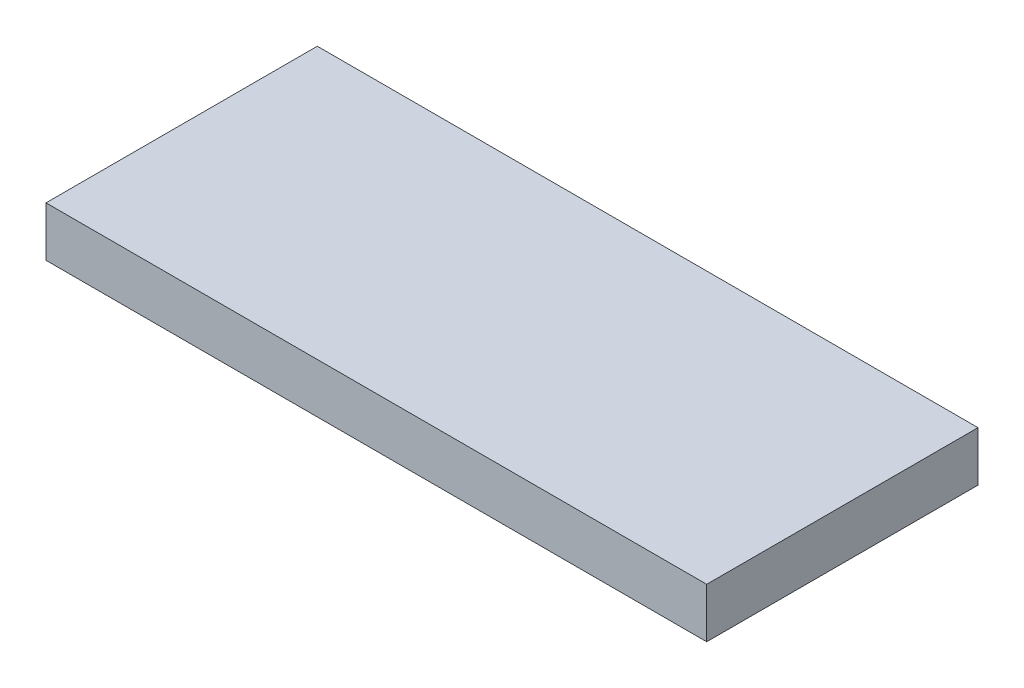
ISO-10303-21;
HEADER;
FILE_DESCRIPTION(('STEP AP214'),'2;1');
FILE_NAME('part.step','',(''),(''),'','','');
FILE_SCHEMA(('AUTOMOTIVE_DESIGN { 1 0 10303 214 1 1 1 1 }'));
ENDSEC;
DATA;
#1=APPLICATION_CONTEXT('core data for automotive mechanical design processes');
#2=APPLICATION_PROTOCOL_DEFINITION('international standard','automotive_design',2000,#1);
#3=PRODUCT_CONTEXT('',#1,'mechanical');
#4=PRODUCT('Part','Part','',(#3));
#5=PRODUCT_RELATED_PRODUCT_CATEGORY('part','',(#4));
#6=PRODUCT_DEFINITION_FORMATION('','',#4);
#7=PRODUCT_DEFINITION_CONTEXT('part definition',#1,'design');
#8=PRODUCT_DEFINITION('design','',#6,#7);
#9=PRODUCT_DEFINITION_SHAPE('','',#8);
#10=(LENGTH_UNIT() NAMED_UNIT(*) SI_UNIT(.MILLI.,.METRE.));
#11=(NAMED_UNIT(*) PLANE_ANGLE_UNIT() SI_UNIT($,.RADIAN.));
#12=(NAMED_UNIT(*) SI_UNIT($,.STERADIAN.) SOLID_ANGLE_UNIT());
#13=UNCERTAINTY_MEASURE_WITH_UNIT(LENGTH_MEASURE(1.E-05),#10,'distance_accuracy_value','');
#14=(GEOMETRIC_REPRESENTATION_CONTEXT(3) GLOBAL_UNCERTAINTY_ASSIGNED_CONTEXT((#13)) GLOBAL_UNIT_ASSIGNED_CONTEXT((#10,
#11,#12)) REPRESENTATION_CONTEXT('',''));
#15=CARTESIAN_POINT('',(0.,0.,0.));
#16=DIRECTION('',(0.,0.,1.));
#17=DIRECTION('',(1.,0.,0.));
#18=AXIS2_PLACEMENT_3D('',#15,#16,#17);
#19=CARTESIAN_POINT('',(-34.1999999999999,1.15622179664975,20.));
#20=DIRECTION('',(1.,0.,0.));
#21=DIRECTION('',(0.,0.,-1.));
#22=AXIS2_PLACEMENT_3D('',#19,#20,#21);
#23=PLANE('',#22);
#24=DIRECTION('',(0.,-1.,0.));
#25=VECTOR('',#24,1.);
#26=CARTESIAN_POINT('',(-34.1999999999999,-1.84377820335027,1.49999999999993));
#27=LINE('',#26,#25);
#28=CARTESIAN_POINT('',(-34.1999999999999,-0.283778203350142,1.49999999999992));
#29=VERTEX_POINT('',#28);
#30=CARTESIAN_POINT('',(-34.1999999999999,-3.40377820335037,1.49999999999995));
#31=VERTEX_POINT('',#30);
#32=EDGE_CURVE('E13',#29,#31,#27,.T.);
#33=ORIENTED_EDGE('',*,*,#32,.T.);
#34=DIRECTION('',(2.44902137784949E-13,0.,-1.));
#35=VECTOR('',#34,1.);
#36=CARTESIAN_POINT('',(-34.1999999999994,-3.40377820335034,10.0000000000005));
#37=LINE('',#36,#35);
#38=CARTESIAN_POINT('',(-34.1999999999999,-3.40377820335037,18.5000000000001));
#39=VERTEX_POINT('',#38);
#40=EDGE_CURVE('E217',#39,#31,#37,.T.);
#41=ORIENTED_EDGE('',*,*,#40,.F.);
#42=DIRECTION('',(0.,-1.,-2.13504427812522E-13));
#43=VECTOR('',#42,1.);
#44=CARTESIAN_POINT('',(-34.1999999999999,-1.8437782033503,18.4999999999999));
#45=LINE('',#44,#43);
#46=CARTESIAN_POINT('',(-34.2,-0.28377820335024,18.5));
#47=VERTEX_POINT('',#46);
#48=EDGE_CURVE('E205',#47,#39,#45,.T.);
#49=ORIENTED_EDGE('',*,*,#48,.F.);
#50=DIRECTION('',(2.71841372941265E-13,0.,-1.));
#51=VECTOR('',#50,1.);
#52=CARTESIAN_POINT('',(-34.1999999999994,-0.283778203350362,10.0000000000002));
#53=LINE('',#52,#51);
#54=EDGE_CURVE('E156',#47,#29,#53,.T.);
#55=ORIENTED_EDGE('',*,*,#54,.T.);
#56=EDGE_LOOP('',(#33,#41,#49,#55));
#57=FACE_BOUND('',#56,.T.);
#58=ADVANCED_FACE('F145',(#57),#23,.F.);
#59=CARTESIAN_POINT('',(-27.,-3.40377820335039,20.));
#60=DIRECTION('',(0.,1.,0.));
#61=DIRECTION('',(0.,0.,1.));
#62=AXIS2_PLACEMENT_3D('',#59,#60,#61);
#63=PLANE('',#62);
#64=DIRECTION('',(1.,0.,0.));
#65=VECTOR('',#64,1.);
#66=CARTESIAN_POINT('',(-13.4999999999991,-3.4037782033504,1.49999999999995));
#67=LINE('',#66,#65);
#68=CARTESIAN_POINT('',(7.20000000000009,-3.40377820335041,1.49999999999995));
#69=VERTEX_POINT('',#68);
#70=EDGE_CURVE('E165',#31,#69,#67,.T.);
#71=ORIENTED_EDGE('',*,*,#70,.T.);
#72=DIRECTION('',(0.,0.,-1.));
#73=VECTOR('',#72,1.);
#74=CARTESIAN_POINT('',(7.20000000000005,-3.40377820335043,9.9999999999999));
#75=LINE('',#74,#73);
#76=CARTESIAN_POINT('',(7.20000000000006,-3.40377820335041,18.5));
#77=VERTEX_POINT('',#76);
#78=EDGE_CURVE('E220',#77,#69,#75,.T.);
#79=ORIENTED_EDGE('',*,*,#78,.F.);
#80=DIRECTION('',(1.,0.,0.));
#81=VECTOR('',#80,1.);
#82=CARTESIAN_POINT('',(-13.4999999999997,-3.40377820335041,18.4999999999996));
#83=LINE('',#82,#81);
#84=EDGE_CURVE('E194',#39,#77,#83,.T.);
#85=ORIENTED_EDGE('',*,*,#84,.F.);
#86=ORIENTED_EDGE('',*,*,#40,.T.);
#87=EDGE_LOOP('',(#71,#79,#85,#86));
#88=FACE_BOUND('',#87,.T.);
#89=ADVANCED_FACE('F241',(#88),#63,.F.);
#90=CARTESIAN_POINT('',(7.20000000000006,1.15622179664971,20.));
#91=DIRECTION('',(-1.,0.,0.));
#92=DIRECTION('',(0.,0.,1.));
#93=AXIS2_PLACEMENT_3D('',#90,#91,#92);
#94=PLANE('',#93);
#95=DIRECTION('',(0.,1.,0.));
#96=VECTOR('',#95,1.);
#97=CARTESIAN_POINT('',(7.20000000000007,-1.84377820335035,1.49999999999993));
#98=LINE('',#97,#96);
#99=CARTESIAN_POINT('',(7.20000000000005,-0.283778203350307,1.49999999999992));
#100=VERTEX_POINT('',#99);
#101=EDGE_CURVE('E202',#69,#100,#98,.T.);
#102=ORIENTED_EDGE('',*,*,#101,.T.);
#103=DIRECTION('',(0.,0.,-1.));
#104=VECTOR('',#103,1.);
#105=CARTESIAN_POINT('',(7.20000000000005,-0.283778203350404,10.));
#106=LINE('',#105,#104);
#107=CARTESIAN_POINT('',(7.20000000000003,-0.283778203350406,18.5));
#108=VERTEX_POINT('',#107);
#109=EDGE_CURVE('E149',#108,#100,#106,.T.);
#110=ORIENTED_EDGE('',*,*,#109,.F.);
#111=DIRECTION('',(0.,1.,2.50200501342818E-13));
#112=VECTOR('',#111,1.);
#113=CARTESIAN_POINT('',(7.20000000000004,-1.84377820335041,18.5));
#114=LINE('',#113,#112);
#115=EDGE_CURVE('E188',#77,#108,#114,.T.);
#116=ORIENTED_EDGE('',*,*,#115,.F.);
#117=ORIENTED_EDGE('',*,*,#78,.T.);
#118=EDGE_LOOP('',(#102,#110,#116,#117));
#119=FACE_BOUND('',#118,.T.);
#120=ADVANCED_FACE('F201',(#119),#94,.F.);
#121=CARTESIAN_POINT('',(-27.,-0.283778203350388,20.));
#122=DIRECTION('',(0.,-1.,0.));
#123=DIRECTION('',(0.,0.,-1.));
#124=AXIS2_PLACEMENT_3D('',#121,#122,#123);
#125=PLANE('',#124);
#126=DIRECTION('',(-1.,0.,0.));
#127=VECTOR('',#126,1.);
#128=CARTESIAN_POINT('',(-13.4999999999986,-0.283778203350378,1.49999999999992));
#129=LINE('',#128,#127);
#130=EDGE_CURVE('E182',#100,#29,#129,.T.);
#131=ORIENTED_EDGE('',*,*,#130,.T.);
#132=ORIENTED_EDGE('',*,*,#54,.F.);
#133=DIRECTION('',(-1.,0.,0.));
#134=VECTOR('',#133,1.);
#135=CARTESIAN_POINT('',(-13.4999999999989,-0.283778203350384,18.4999999999999));
#136=LINE('',#135,#134);
#137=EDGE_CURVE('E192',#108,#47,#136,.T.);
#138=ORIENTED_EDGE('',*,*,#137,.F.);
#139=ORIENTED_EDGE('',*,*,#109,.T.);
#140=EDGE_LOOP('',(#131,#132,#138,#139));
#141=FACE_BOUND('',#140,.T.);
#142=ADVANCED_FACE('F207',(#141),#125,.F.);
#143=CARTESIAN_POINT('',(0.,0.,18.4999999999999));
#144=DIRECTION('',(0.,0.,1.));
#145=DIRECTION('',(1.,0.,0.));
#146=AXIS2_PLACEMENT_3D('',#143,#144,#145);
#147=PLANE('',#146);
#148=ORIENTED_EDGE('',*,*,#48,.T.);
#149=ORIENTED_EDGE('',*,*,#84,.T.);
#150=ORIENTED_EDGE('',*,*,#115,.T.);
#151=ORIENTED_EDGE('',*,*,#137,.T.);
#152=EDGE_LOOP('',(#148,#149,#150,#151));
#153=FACE_BOUND('',#152,.T.);
#154=ADVANCED_FACE('F190',(#153),#147,.T.);
#155=CARTESIAN_POINT('',(0.,0.,1.49999999999993));
#156=DIRECTION('',(0.,0.,1.));
#157=DIRECTION('',(1.,0.,0.));
#158=AXIS2_PLACEMENT_3D('',#155,#156,#157);
#159=PLANE('',#158);
#160=ORIENTED_EDGE('',*,*,#32,.F.);
#161=ORIENTED_EDGE('',*,*,#130,.F.);
#162=ORIENTED_EDGE('',*,*,#101,.F.);
#163=ORIENTED_EDGE('',*,*,#70,.F.);
#164=EDGE_LOOP('',(#160,#161,#162,#163));
#165=FACE_BOUND('',#164,.T.);
#166=ADVANCED_FACE('F147',(#165),#159,.F.);
#167=CLOSED_SHELL('',(#58,#89,#120,#142,#154,#166));
#168=MANIFOLD_SOLID_BREP('B2',#167);
#169=ADVANCED_BREP_SHAPE_REPRESENTATION('',(#18,#168),#14);
#170=SHAPE_DEFINITION_REPRESENTATION(#9,#169);
ENDSEC;
END-ISO-10303-21;
